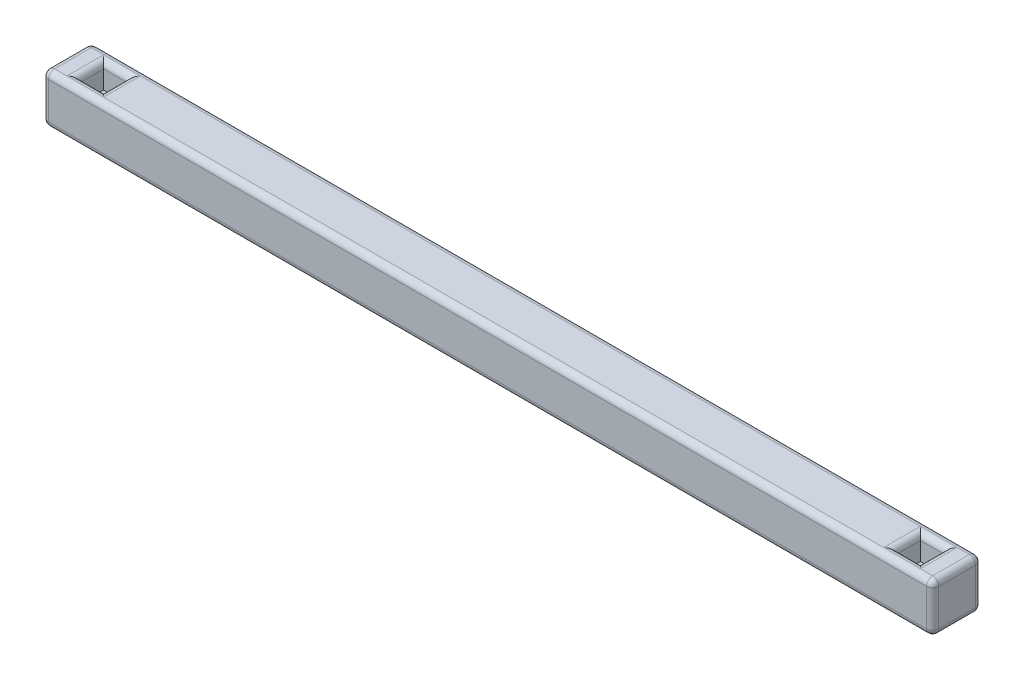
ISO-10303-21;
HEADER;
FILE_DESCRIPTION(('STEP AP214'),'2;1');
FILE_NAME('part.step','',(''),(''),'','','');
FILE_SCHEMA(('AUTOMOTIVE_DESIGN { 1 0 10303 214 1 1 1 1 }'));
ENDSEC;
DATA;
#1=APPLICATION_CONTEXT('core data for automotive mechanical design processes');
#2=APPLICATION_PROTOCOL_DEFINITION('international standard','automotive_design',2000,#1);
#3=PRODUCT_CONTEXT('',#1,'mechanical');
#4=PRODUCT('Part','Part','',(#3));
#5=PRODUCT_RELATED_PRODUCT_CATEGORY('part','',(#4));
#6=PRODUCT_DEFINITION_FORMATION('','',#4);
#7=PRODUCT_DEFINITION_CONTEXT('part definition',#1,'design');
#8=PRODUCT_DEFINITION('design','',#6,#7);
#9=PRODUCT_DEFINITION_SHAPE('','',#8);
#10=(LENGTH_UNIT() NAMED_UNIT(*) SI_UNIT(.MILLI.,.METRE.));
#11=(NAMED_UNIT(*) PLANE_ANGLE_UNIT() SI_UNIT($,.RADIAN.));
#12=(NAMED_UNIT(*) SI_UNIT($,.STERADIAN.) SOLID_ANGLE_UNIT());
#13=UNCERTAINTY_MEASURE_WITH_UNIT(LENGTH_MEASURE(1.E-05),#10,'distance_accuracy_value','');
#14=(GEOMETRIC_REPRESENTATION_CONTEXT(3) GLOBAL_UNCERTAINTY_ASSIGNED_CONTEXT((#13)) GLOBAL_UNIT_ASSIGNED_CONTEXT((#10,
#11,#12)) REPRESENTATION_CONTEXT('',''));
#15=CARTESIAN_POINT('',(0.,0.,0.));
#16=DIRECTION('',(0.,0.,1.));
#17=DIRECTION('',(1.,0.,0.));
#18=AXIS2_PLACEMENT_3D('',#15,#16,#17);
#19=CARTESIAN_POINT('',(0.,12.7,0.));
#20=DIRECTION('',(0.,-1.,0.));
#21=DIRECTION('',(0.,0.,-1.));
#22=AXIS2_PLACEMENT_3D('',#19,#20,#21);
#23=PLANE('',#22);
#24=DIRECTION('',(0.,0.,1.));
#25=VECTOR('',#24,1.);
#26=CARTESIAN_POINT('',(4.76250000000004,12.7,0.));
#27=LINE('',#26,#25);
#28=CARTESIAN_POINT('',(4.76250000000006,12.7,-1.5875));
#29=VERTEX_POINT('',#28);
#30=CARTESIAN_POINT('',(4.76250000000008,12.7,-11.1125000000005));
#31=VERTEX_POINT('',#30);
#32=EDGE_CURVE('E366',#29,#31,#27,.F.);
#33=ORIENTED_EDGE('',*,*,#32,.T.);
#34=DIRECTION('',(1.,0.,0.));
#35=VECTOR('',#34,1.);
#36=CARTESIAN_POINT('',(0.,12.7,-11.1125));
#37=LINE('',#36,#35);
#38=CARTESIAN_POINT('',(1.58750000000002,12.7,-11.1125));
#39=VERTEX_POINT('',#38);
#40=EDGE_CURVE('E372',#31,#39,#37,.F.);
#41=ORIENTED_EDGE('',*,*,#40,.T.);
#42=DIRECTION('',(0.,0.,-1.));
#43=VECTOR('',#42,1.);
#44=CARTESIAN_POINT('',(1.5875,12.7,0.));
#45=LINE('',#44,#43);
#46=CARTESIAN_POINT('',(1.5875,12.7,-1.5875));
#47=VERTEX_POINT('',#46);
#48=EDGE_CURVE('E369',#39,#47,#45,.F.);
#49=ORIENTED_EDGE('',*,*,#48,.T.);
#50=DIRECTION('',(1.,0.,0.));
#51=VECTOR('',#50,1.);
#52=CARTESIAN_POINT('',(0.,12.7,-1.5875));
#53=LINE('',#52,#51);
#54=EDGE_CURVE('E363',#47,#29,#53,.T.);
#55=ORIENTED_EDGE('',*,*,#54,.T.);
#56=EDGE_LOOP('',(#33,#41,#49,#55));
#57=FACE_BOUND('',#56,.T.);
#58=ADVANCED_FACE('F49',(#57),#23,.F.);
#59=DIRECTION('',(0.,0.,1.));
#60=VECTOR('',#59,1.);
#61=CARTESIAN_POINT('',(216.535,12.7,0.));
#62=LINE('',#61,#60);
#63=CARTESIAN_POINT('',(216.535,12.7,-1.5875));
#64=VERTEX_POINT('',#63);
#65=CARTESIAN_POINT('',(216.535,12.7,-11.1125));
#66=VERTEX_POINT('',#65);
#67=EDGE_CURVE('E353',#64,#66,#62,.F.);
#68=ORIENTED_EDGE('',*,*,#67,.T.);
#69=DIRECTION('',(1.,0.,0.));
#70=VECTOR('',#69,1.);
#71=CARTESIAN_POINT('',(0.,12.7,-11.1125));
#72=LINE('',#71,#70);
#73=CARTESIAN_POINT('',(14.2875000000001,12.7,-11.1125000000004));
#74=VERTEX_POINT('',#73);
#75=EDGE_CURVE('E359',#66,#74,#72,.F.);
#76=ORIENTED_EDGE('',*,*,#75,.T.);
#77=DIRECTION('',(0.,0.,-1.));
#78=VECTOR('',#77,1.);
#79=CARTESIAN_POINT('',(14.2875,12.7,0.));
#80=LINE('',#79,#78);
#81=CARTESIAN_POINT('',(14.2875,12.7,-1.5875));
#82=VERTEX_POINT('',#81);
#83=EDGE_CURVE('E356',#74,#82,#80,.F.);
#84=ORIENTED_EDGE('',*,*,#83,.T.);
#85=DIRECTION('',(1.,0.,0.));
#86=VECTOR('',#85,1.);
#87=CARTESIAN_POINT('',(0.,12.7,-1.5875));
#88=LINE('',#87,#86);
#89=EDGE_CURVE('E350',#82,#64,#88,.T.);
#90=ORIENTED_EDGE('',*,*,#89,.T.);
#91=EDGE_LOOP('',(#68,#76,#84,#90));
#92=FACE_BOUND('',#91,.T.);
#93=ADVANCED_FACE('F628',(#92),#23,.F.);
#94=CARTESIAN_POINT('',(0.,12.7,0.));
#95=DIRECTION('',(-1.,0.,0.));
#96=DIRECTION('',(0.,0.,1.));
#97=AXIS2_PLACEMENT_3D('',#94,#95,#96);
#98=PLANE('',#97);
#99=DIRECTION('',(0.,-1.,0.));
#100=VECTOR('',#99,1.);
#101=CARTESIAN_POINT('',(0.,12.7,-11.1125));
#102=LINE('',#101,#100);
#103=CARTESIAN_POINT('',(0.,11.1125,-11.1125));
#104=VERTEX_POINT('',#103);
#105=CARTESIAN_POINT('',(0.,1.5875,-11.1125));
#106=VERTEX_POINT('',#105);
#107=EDGE_CURVE('E317',#104,#106,#102,.T.);
#108=ORIENTED_EDGE('',*,*,#107,.T.);
#109=DIRECTION('',(0.,0.,-1.));
#110=VECTOR('',#109,1.);
#111=CARTESIAN_POINT('',(0.,1.5875,0.));
#112=LINE('',#111,#110);
#113=CARTESIAN_POINT('',(0.,1.5875,-1.5875));
#114=VERTEX_POINT('',#113);
#115=EDGE_CURVE('E320',#106,#114,#112,.F.);
#116=ORIENTED_EDGE('',*,*,#115,.T.);
#117=DIRECTION('',(0.,-1.,0.));
#118=VECTOR('',#117,1.);
#119=CARTESIAN_POINT('',(0.,12.7,-1.5875));
#120=LINE('',#119,#118);
#121=CARTESIAN_POINT('',(0.,11.1125,-1.5875));
#122=VERTEX_POINT('',#121);
#123=EDGE_CURVE('E311',#114,#122,#120,.F.);
#124=ORIENTED_EDGE('',*,*,#123,.T.);
#125=DIRECTION('',(0.,0.,-1.));
#126=VECTOR('',#125,1.);
#127=CARTESIAN_POINT('',(0.,11.1125,-12.7));
#128=LINE('',#127,#126);
#129=EDGE_CURVE('E314',#122,#104,#128,.T.);
#130=ORIENTED_EDGE('',*,*,#129,.T.);
#131=EDGE_LOOP('',(#108,#116,#124,#130));
#132=FACE_BOUND('',#131,.T.);
#133=ADVANCED_FACE('F635',(#132),#98,.T.);
#134=CARTESIAN_POINT('',(0.,12.7,0.));
#135=DIRECTION('',(0.,0.,-1.));
#136=DIRECTION('',(-1.,0.,0.));
#137=AXIS2_PLACEMENT_3D('',#134,#135,#136);
#138=PLANE('',#137);
#139=DIRECTION('',(1.,0.,0.));
#140=VECTOR('',#139,1.);
#141=CARTESIAN_POINT('',(0.,11.1125,0.));
#142=LINE('',#141,#140);
#143=CARTESIAN_POINT('',(229.235,11.1125,0.));
#144=VERTEX_POINT('',#143);
#145=CARTESIAN_POINT('',(1.5875,11.1125,0.));
#146=VERTEX_POINT('',#145);
#147=EDGE_CURVE('E59',#144,#146,#142,.F.);
#148=ORIENTED_EDGE('',*,*,#147,.T.);
#149=DIRECTION('',(0.,-1.,0.));
#150=VECTOR('',#149,1.);
#151=CARTESIAN_POINT('',(1.5875,0.,0.));
#152=LINE('',#151,#150);
#153=CARTESIAN_POINT('',(1.5875,1.5875,0.));
#154=VERTEX_POINT('',#153);
#155=EDGE_CURVE('E11',#146,#154,#152,.T.);
#156=ORIENTED_EDGE('',*,*,#155,.T.);
#157=DIRECTION('',(1.,0.,0.));
#158=VECTOR('',#157,1.);
#159=CARTESIAN_POINT('',(230.8225,1.5875,0.));
#160=LINE('',#159,#158);
#161=CARTESIAN_POINT('',(229.235,1.5875,0.));
#162=VERTEX_POINT('',#161);
#163=EDGE_CURVE('E401',#154,#162,#160,.T.);
#164=ORIENTED_EDGE('',*,*,#163,.T.);
#165=DIRECTION('',(0.,-1.,0.));
#166=VECTOR('',#165,1.);
#167=CARTESIAN_POINT('',(229.235,12.7,0.));
#168=LINE('',#167,#166);
#169=EDGE_CURVE('E70',#162,#144,#168,.F.);
#170=ORIENTED_EDGE('',*,*,#169,.T.);
#171=EDGE_LOOP('',(#148,#156,#164,#170));
#172=FACE_BOUND('',#171,.T.);
#173=ADVANCED_FACE('F557',(#172),#138,.F.);
#174=CARTESIAN_POINT('',(230.8225,12.7,0.));
#175=DIRECTION('',(-1.,0.,0.));
#176=DIRECTION('',(0.,0.,1.));
#177=AXIS2_PLACEMENT_3D('',#174,#175,#176);
#178=PLANE('',#177);
#179=DIRECTION('',(0.,-1.,0.));
#180=VECTOR('',#179,1.);
#181=CARTESIAN_POINT('',(230.8225,12.7,-1.5875));
#182=LINE('',#181,#180);
#183=CARTESIAN_POINT('',(230.8225,11.1125,-1.5875));
#184=VERTEX_POINT('',#183);
#185=CARTESIAN_POINT('',(230.8225,1.5875,-1.5875));
#186=VERTEX_POINT('',#185);
#187=EDGE_CURVE('E252',#184,#186,#182,.T.);
#188=ORIENTED_EDGE('',*,*,#187,.T.);
#189=DIRECTION('',(0.,0.,-1.));
#190=VECTOR('',#189,1.);
#191=CARTESIAN_POINT('',(230.8225,1.5875,-12.7));
#192=LINE('',#191,#190);
#193=CARTESIAN_POINT('',(230.8225,1.5875,-11.1125));
#194=VERTEX_POINT('',#193);
#195=EDGE_CURVE('E294',#186,#194,#192,.T.);
#196=ORIENTED_EDGE('',*,*,#195,.T.);
#197=DIRECTION('',(0.,-1.,0.));
#198=VECTOR('',#197,1.);
#199=CARTESIAN_POINT('',(230.8225,12.7,-11.1125));
#200=LINE('',#199,#198);
#201=CARTESIAN_POINT('',(230.8225,11.1125,-11.1125));
#202=VERTEX_POINT('',#201);
#203=EDGE_CURVE('E291',#194,#202,#200,.F.);
#204=ORIENTED_EDGE('',*,*,#203,.T.);
#205=DIRECTION('',(0.,0.,-1.));
#206=VECTOR('',#205,1.);
#207=CARTESIAN_POINT('',(230.8225,11.1125,0.));
#208=LINE('',#207,#206);
#209=EDGE_CURVE('E288',#202,#184,#208,.F.);
#210=ORIENTED_EDGE('',*,*,#209,.T.);
#211=EDGE_LOOP('',(#188,#196,#204,#210));
#212=FACE_BOUND('',#211,.T.);
#213=ADVANCED_FACE('F577',(#212),#178,.F.);
#214=CARTESIAN_POINT('',(0.,12.7,-12.7));
#215=DIRECTION('',(0.,0.,-1.));
#216=DIRECTION('',(-1.,0.,0.));
#217=AXIS2_PLACEMENT_3D('',#214,#215,#216);
#218=PLANE('',#217);
#219=DIRECTION('',(0.,-1.,0.));
#220=VECTOR('',#219,1.);
#221=CARTESIAN_POINT('',(229.235,0.,-12.7));
#222=LINE('',#221,#220);
#223=CARTESIAN_POINT('',(229.235,11.1125,-12.7));
#224=VERTEX_POINT('',#223);
#225=CARTESIAN_POINT('',(229.235,1.5875,-12.7));
#226=VERTEX_POINT('',#225);
#227=EDGE_CURVE('E330',#224,#226,#222,.T.);
#228=ORIENTED_EDGE('',*,*,#227,.T.);
#229=DIRECTION('',(1.,0.,0.));
#230=VECTOR('',#229,1.);
#231=CARTESIAN_POINT('',(0.,1.5875,-12.7));
#232=LINE('',#231,#230);
#233=CARTESIAN_POINT('',(1.58750000000002,1.5875,-12.7));
#234=VERTEX_POINT('',#233);
#235=EDGE_CURVE('E334',#226,#234,#232,.F.);
#236=ORIENTED_EDGE('',*,*,#235,.T.);
#237=DIRECTION('',(0.,-1.,0.));
#238=VECTOR('',#237,1.);
#239=CARTESIAN_POINT('',(1.58750000000002,12.7,-12.7));
#240=LINE('',#239,#238);
#241=CARTESIAN_POINT('',(1.58750000000002,11.1125,-12.7));
#242=VERTEX_POINT('',#241);
#243=EDGE_CURVE('E327',#234,#242,#240,.F.);
#244=ORIENTED_EDGE('',*,*,#243,.T.);
#245=DIRECTION('',(1.,0.,0.));
#246=VECTOR('',#245,1.);
#247=CARTESIAN_POINT('',(230.8225,11.1125,-12.7));
#248=LINE('',#247,#246);
#249=EDGE_CURVE('E324',#242,#224,#248,.T.);
#250=ORIENTED_EDGE('',*,*,#249,.T.);
#251=EDGE_LOOP('',(#228,#236,#244,#250));
#252=FACE_BOUND('',#251,.T.);
#253=ADVANCED_FACE('F641',(#252),#218,.T.);
#254=DIRECTION('',(0.,0.,-1.));
#255=VECTOR('',#254,1.);
#256=CARTESIAN_POINT('',(229.235,12.7,5.00988139862102E-13));
#257=LINE('',#256,#255);
#258=CARTESIAN_POINT('',(229.235,12.7,-1.5875));
#259=VERTEX_POINT('',#258);
#260=CARTESIAN_POINT('',(229.235,12.7,-11.1125));
#261=VERTEX_POINT('',#260);
#262=EDGE_CURVE('E343',#259,#261,#257,.T.);
#263=ORIENTED_EDGE('',*,*,#262,.T.);
#264=DIRECTION('',(1.,0.,0.));
#265=VECTOR('',#264,1.);
#266=CARTESIAN_POINT('',(0.,12.7,-11.1125));
#267=LINE('',#266,#265);
#268=CARTESIAN_POINT('',(226.06,12.7,-11.1125));
#269=VERTEX_POINT('',#268);
#270=EDGE_CURVE('E346',#261,#269,#267,.F.);
#271=ORIENTED_EDGE('',*,*,#270,.T.);
#272=DIRECTION('',(0.,0.,-1.));
#273=VECTOR('',#272,1.);
#274=CARTESIAN_POINT('',(226.06,12.7,0.));
#275=LINE('',#274,#273);
#276=CARTESIAN_POINT('',(226.06,12.7,-1.5875));
#277=VERTEX_POINT('',#276);
#278=EDGE_CURVE('E340',#269,#277,#275,.F.);
#279=ORIENTED_EDGE('',*,*,#278,.T.);
#280=DIRECTION('',(1.,0.,0.));
#281=VECTOR('',#280,1.);
#282=CARTESIAN_POINT('',(0.,12.7,-1.5875));
#283=LINE('',#282,#281);
#284=EDGE_CURVE('E337',#277,#259,#283,.T.);
#285=ORIENTED_EDGE('',*,*,#284,.T.);
#286=EDGE_LOOP('',(#263,#271,#279,#285));
#287=FACE_BOUND('',#286,.T.);
#288=ADVANCED_FACE('F630',(#287),#23,.F.);
#289=CARTESIAN_POINT('',(0.,0.,0.));
#290=DIRECTION('',(0.,-1.,0.));
#291=DIRECTION('',(0.,0.,-1.));
#292=AXIS2_PLACEMENT_3D('',#289,#290,#291);
#293=PLANE('',#292);
#294=DIRECTION('',(0.,0.,-1.));
#295=VECTOR('',#294,1.);
#296=CARTESIAN_POINT('',(1.5875,0.,0.));
#297=LINE('',#296,#295);
#298=CARTESIAN_POINT('',(1.5875,0.,-1.5875));
#299=VERTEX_POINT('',#298);
#300=CARTESIAN_POINT('',(1.58750000000002,0.,-11.1125));
#301=VERTEX_POINT('',#300);
#302=EDGE_CURVE('E301',#299,#301,#297,.T.);
#303=ORIENTED_EDGE('',*,*,#302,.T.);
#304=DIRECTION('',(1.,0.,0.));
#305=VECTOR('',#304,1.);
#306=CARTESIAN_POINT('',(0.,0.,-11.1125));
#307=LINE('',#306,#305);
#308=CARTESIAN_POINT('',(229.235,0.,-11.1125));
#309=VERTEX_POINT('',#308);
#310=EDGE_CURVE('E308',#301,#309,#307,.T.);
#311=ORIENTED_EDGE('',*,*,#310,.T.);
#312=DIRECTION('',(0.,0.,-1.));
#313=VECTOR('',#312,1.);
#314=CARTESIAN_POINT('',(229.235,0.,0.));
#315=LINE('',#314,#313);
#316=CARTESIAN_POINT('',(229.235,0.,-1.5875));
#317=VERTEX_POINT('',#316);
#318=EDGE_CURVE('E304',#309,#317,#315,.F.);
#319=ORIENTED_EDGE('',*,*,#318,.T.);
#320=DIRECTION('',(1.,0.,0.));
#321=VECTOR('',#320,1.);
#322=CARTESIAN_POINT('',(0.,0.,-1.5875));
#323=LINE('',#322,#321);
#324=EDGE_CURVE('E298',#317,#299,#323,.F.);
#325=ORIENTED_EDGE('',*,*,#324,.T.);
#326=EDGE_LOOP('',(#303,#311,#319,#325));
#327=FACE_BOUND('',#326,.T.);
#328=ADVANCED_FACE('F640',(#327),#293,.T.);
#329=CARTESIAN_POINT('',(12.7000000000001,6.35,-9.52500000000045));
#330=DIRECTION('',(1.,0.,0.));
#331=DIRECTION('',(0.,0.,-1.));
#332=AXIS2_PLACEMENT_3D('',#329,#330,#331);
#333=PLANE('',#332);
#334=DIRECTION('',(0.,1.,0.));
#335=VECTOR('',#334,1.);
#336=CARTESIAN_POINT('',(12.7,6.35,-3.17500000000045));
#337=LINE('',#336,#335);
#338=CARTESIAN_POINT('',(12.7,6.35,-3.17500000000045));
#339=VERTEX_POINT('',#338);
#340=CARTESIAN_POINT('',(12.7,11.1125,-3.17500000000045));
#341=VERTEX_POINT('',#340);
#342=EDGE_CURVE('E272',#339,#341,#337,.T.);
#343=ORIENTED_EDGE('',*,*,#342,.T.);
#344=DIRECTION('',(0.,0.,-1.));
#345=VECTOR('',#344,1.);
#346=CARTESIAN_POINT('',(12.7000000000001,11.1125,-9.52500000000045));
#347=LINE('',#346,#345);
#348=CARTESIAN_POINT('',(12.7000000000001,11.1125,-9.52500000000045));
#349=VERTEX_POINT('',#348);
#350=EDGE_CURVE('E383',#341,#349,#347,.T.);
#351=ORIENTED_EDGE('',*,*,#350,.T.);
#352=DIRECTION('',(0.,1.,0.));
#353=VECTOR('',#352,1.);
#354=CARTESIAN_POINT('',(12.7000000000001,6.35,-9.52500000000045));
#355=LINE('',#354,#353);
#356=CARTESIAN_POINT('',(12.7000000000001,6.35,-9.52500000000045));
#357=VERTEX_POINT('',#356);
#358=EDGE_CURVE('E259',#357,#349,#355,.T.);
#359=ORIENTED_EDGE('',*,*,#358,.F.);
#360=DIRECTION('',(0.,0.,-1.));
#361=VECTOR('',#360,1.);
#362=CARTESIAN_POINT('',(12.7000000000001,6.35,-9.52500000000045));
#363=LINE('',#362,#361);
#364=EDGE_CURVE('E238',#339,#357,#363,.T.);
#365=ORIENTED_EDGE('',*,*,#364,.F.);
#366=EDGE_LOOP('',(#343,#351,#359,#365));
#367=FACE_BOUND('',#366,.T.);
#368=ADVANCED_FACE('F647',(#367),#333,.F.);
#369=CARTESIAN_POINT('',(12.7,6.35,-3.17500000000045));
#370=DIRECTION('',(0.,0.,1.));
#371=DIRECTION('',(1.,0.,0.));
#372=AXIS2_PLACEMENT_3D('',#369,#370,#371);
#373=PLANE('',#372);
#374=DIRECTION('',(0.,1.,0.));
#375=VECTOR('',#374,1.);
#376=CARTESIAN_POINT('',(6.35000000000005,6.35,-3.17500000000048));
#377=LINE('',#376,#375);
#378=CARTESIAN_POINT('',(6.35000000000005,6.35,-3.17500000000048));
#379=VERTEX_POINT('',#378);
#380=CARTESIAN_POINT('',(6.35000000000005,11.1125,-3.17500000000048));
#381=VERTEX_POINT('',#380);
#382=EDGE_CURVE('E268',#379,#381,#377,.T.);
#383=ORIENTED_EDGE('',*,*,#382,.T.);
#384=DIRECTION('',(1.,0.,0.));
#385=VECTOR('',#384,1.);
#386=CARTESIAN_POINT('',(12.7,11.1125,-3.17500000000045));
#387=LINE('',#386,#385);
#388=EDGE_CURVE('E380',#381,#341,#387,.T.);
#389=ORIENTED_EDGE('',*,*,#388,.T.);
#390=ORIENTED_EDGE('',*,*,#342,.F.);
#391=DIRECTION('',(1.,0.,0.));
#392=VECTOR('',#391,1.);
#393=CARTESIAN_POINT('',(12.7,6.35,-3.17500000000045));
#394=LINE('',#393,#392);
#395=EDGE_CURVE('E263',#379,#339,#394,.T.);
#396=ORIENTED_EDGE('',*,*,#395,.F.);
#397=EDGE_LOOP('',(#383,#389,#390,#396));
#398=FACE_BOUND('',#397,.T.);
#399=ADVANCED_FACE('F712',(#398),#373,.F.);
#400=CARTESIAN_POINT('',(6.35000000000008,6.35,-9.52500000000048));
#401=DIRECTION('',(-1.,0.,0.));
#402=DIRECTION('',(0.,0.,1.));
#403=AXIS2_PLACEMENT_3D('',#400,#401,#402);
#404=PLANE('',#403);
#405=DIRECTION('',(0.,1.,0.));
#406=VECTOR('',#405,1.);
#407=CARTESIAN_POINT('',(6.35000000000008,6.35,-9.52500000000048));
#408=LINE('',#407,#406);
#409=CARTESIAN_POINT('',(6.35000000000008,6.35,-9.52500000000048));
#410=VERTEX_POINT('',#409);
#411=CARTESIAN_POINT('',(6.35000000000008,11.1125,-9.52500000000048));
#412=VERTEX_POINT('',#411);
#413=EDGE_CURVE('E264',#410,#412,#408,.T.);
#414=ORIENTED_EDGE('',*,*,#413,.T.);
#415=DIRECTION('',(0.,0.,1.));
#416=VECTOR('',#415,1.);
#417=CARTESIAN_POINT('',(6.35000000000008,11.1125,-9.52500000000048));
#418=LINE('',#417,#416);
#419=EDGE_CURVE('E376',#412,#381,#418,.T.);
#420=ORIENTED_EDGE('',*,*,#419,.T.);
#421=ORIENTED_EDGE('',*,*,#382,.F.);
#422=DIRECTION('',(0.,0.,1.));
#423=VECTOR('',#422,1.);
#424=CARTESIAN_POINT('',(6.35000000000008,6.35,-9.52500000000048));
#425=LINE('',#424,#423);
#426=EDGE_CURVE('E279',#410,#379,#425,.T.);
#427=ORIENTED_EDGE('',*,*,#426,.F.);
#428=EDGE_LOOP('',(#414,#420,#421,#427));
#429=FACE_BOUND('',#428,.T.);
#430=ADVANCED_FACE('F723',(#429),#404,.F.);
#431=CARTESIAN_POINT('',(12.7000000000001,6.35,-9.52500000000045));
#432=DIRECTION('',(0.,0.,-1.));
#433=DIRECTION('',(-1.,0.,0.));
#434=AXIS2_PLACEMENT_3D('',#431,#432,#433);
#435=PLANE('',#434);
#436=ORIENTED_EDGE('',*,*,#358,.T.);
#437=DIRECTION('',(-1.,0.,0.));
#438=VECTOR('',#437,1.);
#439=CARTESIAN_POINT('',(12.7000000000001,11.1125,-9.52500000000045));
#440=LINE('',#439,#438);
#441=EDGE_CURVE('E386',#349,#412,#440,.T.);
#442=ORIENTED_EDGE('',*,*,#441,.T.);
#443=ORIENTED_EDGE('',*,*,#413,.F.);
#444=DIRECTION('',(-1.,0.,0.));
#445=VECTOR('',#444,1.);
#446=CARTESIAN_POINT('',(12.7000000000001,6.35,-9.52500000000045));
#447=LINE('',#446,#445);
#448=EDGE_CURVE('E242',#357,#410,#447,.T.);
#449=ORIENTED_EDGE('',*,*,#448,.F.);
#450=EDGE_LOOP('',(#436,#442,#443,#449));
#451=FACE_BOUND('',#450,.T.);
#452=ADVANCED_FACE('F719',(#451),#435,.F.);
#453=CARTESIAN_POINT('',(0.,6.35,0.));
#454=DIRECTION('',(0.,-1.,0.));
#455=DIRECTION('',(0.,0.,-1.));
#456=AXIS2_PLACEMENT_3D('',#453,#454,#455);
#457=PLANE('',#456);
#458=ORIENTED_EDGE('',*,*,#364,.T.);
#459=ORIENTED_EDGE('',*,*,#448,.T.);
#460=ORIENTED_EDGE('',*,*,#426,.T.);
#461=ORIENTED_EDGE('',*,*,#395,.T.);
#462=EDGE_LOOP('',(#458,#459,#460,#461));
#463=FACE_BOUND('',#462,.T.);
#464=ADVANCED_FACE('F725',(#463),#457,.F.);
#465=CARTESIAN_POINT('',(218.1225,6.35,-9.525));
#466=DIRECTION('',(-1.,0.,0.));
#467=DIRECTION('',(0.,0.,1.));
#468=AXIS2_PLACEMENT_3D('',#465,#466,#467);
#469=PLANE('',#468);
#470=DIRECTION('',(0.,1.,0.));
#471=VECTOR('',#470,1.);
#472=CARTESIAN_POINT('',(218.1225,6.35,-9.525));
#473=LINE('',#472,#471);
#474=CARTESIAN_POINT('',(218.1225,6.35,-9.525));
#475=VERTEX_POINT('',#474);
#476=CARTESIAN_POINT('',(218.1225,11.1125,-9.525));
#477=VERTEX_POINT('',#476);
#478=EDGE_CURVE('E249',#475,#477,#473,.T.);
#479=ORIENTED_EDGE('',*,*,#478,.T.);
#480=DIRECTION('',(0.,0.,1.));
#481=VECTOR('',#480,1.);
#482=CARTESIAN_POINT('',(218.1225,11.1125,-9.525));
#483=LINE('',#482,#481);
#484=CARTESIAN_POINT('',(218.1225,11.1125,-3.175));
#485=VERTEX_POINT('',#484);
#486=EDGE_CURVE('E218',#477,#485,#483,.T.);
#487=ORIENTED_EDGE('',*,*,#486,.T.);
#488=DIRECTION('',(0.,1.,0.));
#489=VECTOR('',#488,1.);
#490=CARTESIAN_POINT('',(218.1225,6.35,-3.175));
#491=LINE('',#490,#489);
#492=CARTESIAN_POINT('',(218.1225,6.35,-3.175));
#493=VERTEX_POINT('',#492);
#494=EDGE_CURVE('E210',#493,#485,#491,.T.);
#495=ORIENTED_EDGE('',*,*,#494,.F.);
#496=DIRECTION('',(0.,0.,1.));
#497=VECTOR('',#496,1.);
#498=CARTESIAN_POINT('',(218.1225,6.35,-9.525));
#499=LINE('',#498,#497);
#500=EDGE_CURVE('E215',#475,#493,#499,.T.);
#501=ORIENTED_EDGE('',*,*,#500,.F.);
#502=EDGE_LOOP('',(#479,#487,#495,#501));
#503=FACE_BOUND('',#502,.T.);
#504=ADVANCED_FACE('F213',(#503),#469,.F.);
#505=CARTESIAN_POINT('',(218.1225,6.35,-9.525));
#506=DIRECTION('',(0.,0.,-1.));
#507=DIRECTION('',(-1.,0.,0.));
#508=AXIS2_PLACEMENT_3D('',#505,#506,#507);
#509=PLANE('',#508);
#510=DIRECTION('',(0.,1.,0.));
#511=VECTOR('',#510,1.);
#512=CARTESIAN_POINT('',(224.4725,6.35,-9.525));
#513=LINE('',#512,#511);
#514=CARTESIAN_POINT('',(224.4725,6.35,-9.525));
#515=VERTEX_POINT('',#514);
#516=CARTESIAN_POINT('',(224.4725,11.1125,-9.525));
#517=VERTEX_POINT('',#516);
#518=EDGE_CURVE('E253',#515,#517,#513,.T.);
#519=ORIENTED_EDGE('',*,*,#518,.T.);
#520=DIRECTION('',(-1.,0.,0.));
#521=VECTOR('',#520,1.);
#522=CARTESIAN_POINT('',(218.1225,11.1125,-9.525));
#523=LINE('',#522,#521);
#524=EDGE_CURVE('E393',#517,#477,#523,.T.);
#525=ORIENTED_EDGE('',*,*,#524,.T.);
#526=ORIENTED_EDGE('',*,*,#478,.F.);
#527=DIRECTION('',(-1.,0.,0.));
#528=VECTOR('',#527,1.);
#529=CARTESIAN_POINT('',(218.1225,6.35,-9.525));
#530=LINE('',#529,#528);
#531=EDGE_CURVE('E223',#515,#475,#530,.T.);
#532=ORIENTED_EDGE('',*,*,#531,.F.);
#533=EDGE_LOOP('',(#519,#525,#526,#532));
#534=FACE_BOUND('',#533,.T.);
#535=ADVANCED_FACE('F730',(#534),#509,.F.);
#536=CARTESIAN_POINT('',(224.4725,6.35,-9.525));
#537=DIRECTION('',(1.,0.,0.));
#538=DIRECTION('',(0.,0.,-1.));
#539=AXIS2_PLACEMENT_3D('',#536,#537,#538);
#540=PLANE('',#539);
#541=DIRECTION('',(0.,1.,0.));
#542=VECTOR('',#541,1.);
#543=CARTESIAN_POINT('',(224.4725,6.35,-3.175));
#544=LINE('',#543,#542);
#545=CARTESIAN_POINT('',(224.4725,6.35,-3.175));
#546=VERTEX_POINT('',#545);
#547=CARTESIAN_POINT('',(224.4725,11.1125,-3.175));
#548=VERTEX_POINT('',#547);
#549=EDGE_CURVE('E222',#546,#548,#544,.T.);
#550=ORIENTED_EDGE('',*,*,#549,.T.);
#551=DIRECTION('',(0.,0.,-1.));
#552=VECTOR('',#551,1.);
#553=CARTESIAN_POINT('',(224.4725,11.1125,-9.525));
#554=LINE('',#553,#552);
#555=EDGE_CURVE('E389',#548,#517,#554,.T.);
#556=ORIENTED_EDGE('',*,*,#555,.T.);
#557=ORIENTED_EDGE('',*,*,#518,.F.);
#558=DIRECTION('',(0.,0.,-1.));
#559=VECTOR('',#558,1.);
#560=CARTESIAN_POINT('',(224.4725,6.35,-9.525));
#561=LINE('',#560,#559);
#562=EDGE_CURVE('E233',#546,#515,#561,.T.);
#563=ORIENTED_EDGE('',*,*,#562,.F.);
#564=EDGE_LOOP('',(#550,#556,#557,#563));
#565=FACE_BOUND('',#564,.T.);
#566=ADVANCED_FACE('F743',(#565),#540,.F.);
#567=CARTESIAN_POINT('',(218.1225,6.35,-3.175));
#568=DIRECTION('',(0.,0.,1.));
#569=DIRECTION('',(1.,0.,0.));
#570=AXIS2_PLACEMENT_3D('',#567,#568,#569);
#571=PLANE('',#570);
#572=ORIENTED_EDGE('',*,*,#494,.T.);
#573=DIRECTION('',(1.,0.,0.));
#574=VECTOR('',#573,1.);
#575=CARTESIAN_POINT('',(218.1225,11.1125,-3.175));
#576=LINE('',#575,#574);
#577=EDGE_CURVE('E398',#485,#548,#576,.T.);
#578=ORIENTED_EDGE('',*,*,#577,.T.);
#579=ORIENTED_EDGE('',*,*,#549,.F.);
#580=DIRECTION('',(1.,0.,0.));
#581=VECTOR('',#580,1.);
#582=CARTESIAN_POINT('',(218.1225,6.35,-3.175));
#583=LINE('',#582,#581);
#584=EDGE_CURVE('E226',#493,#546,#583,.T.);
#585=ORIENTED_EDGE('',*,*,#584,.F.);
#586=EDGE_LOOP('',(#572,#578,#579,#585));
#587=FACE_BOUND('',#586,.T.);
#588=ADVANCED_FACE('F227',(#587),#571,.F.);
#589=CARTESIAN_POINT('',(0.,6.35,0.));
#590=DIRECTION('',(0.,1.,0.));
#591=DIRECTION('',(0.,0.,1.));
#592=AXIS2_PLACEMENT_3D('',#589,#590,#591);
#593=PLANE('',#592);
#594=ORIENTED_EDGE('',*,*,#500,.T.);
#595=ORIENTED_EDGE('',*,*,#584,.T.);
#596=ORIENTED_EDGE('',*,*,#562,.T.);
#597=ORIENTED_EDGE('',*,*,#531,.T.);
#598=EDGE_LOOP('',(#594,#595,#596,#597));
#599=FACE_BOUND('',#598,.T.);
#600=ADVANCED_FACE('F235',(#599),#593,.T.);
#601=CARTESIAN_POINT('',(226.06,11.1125,-9.525));
#602=DIRECTION('',(0.,0.,-1.));
#603=DIRECTION('',(-1.,0.,0.));
#604=AXIS2_PLACEMENT_3D('',#601,#602,#603);
#605=CYLINDRICAL_SURFACE('',#604,1.5875);
#606=CARTESIAN_POINT('',(226.06,11.1125,-11.1125));
#607=DIRECTION('',(-0.707106781186547,0.,-0.707106781186547));
#608=DIRECTION('',(0.707106781186547,0.,-0.707106781186547));
#609=AXIS2_PLACEMENT_3D('',#606,#607,#608);
#610=ELLIPSE('',#609,2.24506403026729,1.5875);
#611=EDGE_CURVE('E520',#517,#269,#610,.T.);
#612=ORIENTED_EDGE('',*,*,#611,.F.);
#613=ORIENTED_EDGE('',*,*,#555,.F.);
#614=CARTESIAN_POINT('',(226.06,11.1125,-1.5875));
#615=DIRECTION('',(0.707106781186548,0.,-0.707106781186547));
#616=DIRECTION('',(-0.707106781186547,0.,-0.707106781186547));
#617=AXIS2_PLACEMENT_3D('',#614,#615,#616);
#618=ELLIPSE('',#617,2.24506403026729,1.5875);
#619=EDGE_CURVE('E524',#277,#548,#618,.F.);
#620=ORIENTED_EDGE('',*,*,#619,.F.);
#621=ORIENTED_EDGE('',*,*,#278,.F.);
#622=EDGE_LOOP('',(#612,#613,#620,#621));
#623=FACE_BOUND('',#622,.T.);
#624=ADVANCED_FACE('F51',(#623),#605,.T.);
#625=CARTESIAN_POINT('',(216.535,11.1125,-9.525));
#626=DIRECTION('',(0.,0.,1.));
#627=DIRECTION('',(1.,0.,0.));
#628=AXIS2_PLACEMENT_3D('',#625,#626,#627);
#629=CYLINDRICAL_SURFACE('',#628,1.5875);
#630=CARTESIAN_POINT('',(216.535,11.1125,-11.1125));
#631=DIRECTION('',(-0.707106781186547,0.,0.707106781186547));
#632=DIRECTION('',(-0.707106781186547,0.,-0.707106781186547));
#633=AXIS2_PLACEMENT_3D('',#630,#631,#632);
#634=ELLIPSE('',#633,2.24506403026729,1.5875);
#635=EDGE_CURVE('E516',#66,#477,#634,.F.);
#636=ORIENTED_EDGE('',*,*,#635,.F.);
#637=ORIENTED_EDGE('',*,*,#67,.F.);
#638=CARTESIAN_POINT('',(216.535,11.1125,-1.5875));
#639=DIRECTION('',(0.707106781186547,0.,0.707106781186547));
#640=DIRECTION('',(-0.707106781186548,0.,0.707106781186547));
#641=AXIS2_PLACEMENT_3D('',#638,#639,#640);
#642=ELLIPSE('',#641,2.24506403026729,1.5875);
#643=EDGE_CURVE('E528',#485,#64,#642,.T.);
#644=ORIENTED_EDGE('',*,*,#643,.F.);
#645=ORIENTED_EDGE('',*,*,#486,.F.);
#646=EDGE_LOOP('',(#636,#637,#644,#645));
#647=FACE_BOUND('',#646,.T.);
#648=ADVANCED_FACE('F753',(#647),#629,.T.);
#649=CARTESIAN_POINT('',(14.2875000000001,11.1125,-9.52500000000044));
#650=DIRECTION('',(0.,0.,-1.));
#651=DIRECTION('',(-1.,0.,0.));
#652=AXIS2_PLACEMENT_3D('',#649,#650,#651);
#653=CYLINDRICAL_SURFACE('',#652,1.5875);
#654=CARTESIAN_POINT('',(14.2875000000001,11.1125,-11.1125000000004));
#655=DIRECTION('',(-0.707106781186544,0.,-0.707106781186551));
#656=DIRECTION('',(0.707106781186551,0.,-0.707106781186544));
#657=AXIS2_PLACEMENT_3D('',#654,#655,#656);
#658=ELLIPSE('',#657,2.24506403026729,1.5875);
#659=EDGE_CURVE('E512',#349,#74,#658,.T.);
#660=ORIENTED_EDGE('',*,*,#659,.F.);
#661=ORIENTED_EDGE('',*,*,#350,.F.);
#662=CARTESIAN_POINT('',(14.2875,11.1125,-1.58750000000044));
#663=DIRECTION('',(0.707106781186551,0.,-0.707106781186544));
#664=DIRECTION('',(0.707106781186544,0.,0.707106781186551));
#665=AXIS2_PLACEMENT_3D('',#662,#663,#664);
#666=ELLIPSE('',#665,2.24506403026729,1.5875);
#667=EDGE_CURVE('E532',#82,#341,#666,.F.);
#668=ORIENTED_EDGE('',*,*,#667,.F.);
#669=ORIENTED_EDGE('',*,*,#83,.F.);
#670=EDGE_LOOP('',(#660,#661,#668,#669));
#671=FACE_BOUND('',#670,.T.);
#672=ADVANCED_FACE('F625',(#671),#653,.T.);
#673=CARTESIAN_POINT('',(4.76250000000008,11.1125,-9.52500000000049));
#674=DIRECTION('',(0.,0.,1.));
#675=DIRECTION('',(1.,0.,0.));
#676=AXIS2_PLACEMENT_3D('',#673,#674,#675);
#677=CYLINDRICAL_SURFACE('',#676,1.5875);
#678=CARTESIAN_POINT('',(4.76250000000008,11.1125,-11.1125000000005));
#679=DIRECTION('',(-0.707106781186551,0.,0.707106781186544));
#680=DIRECTION('',(0.707106781186544,0.,0.707106781186551));
#681=AXIS2_PLACEMENT_3D('',#678,#679,#680);
#682=ELLIPSE('',#681,2.24506403026729,1.5875);
#683=EDGE_CURVE('E508',#31,#412,#682,.F.);
#684=ORIENTED_EDGE('',*,*,#683,.F.);
#685=ORIENTED_EDGE('',*,*,#32,.F.);
#686=CARTESIAN_POINT('',(4.76250000000004,11.1125,-1.58750000000048));
#687=DIRECTION('',(0.707106781186544,0.,0.707106781186551));
#688=DIRECTION('',(-0.707106781186551,0.,0.707106781186544));
#689=AXIS2_PLACEMENT_3D('',#686,#687,#688);
#690=ELLIPSE('',#689,2.24506403026729,1.5875);
#691=EDGE_CURVE('E535',#381,#29,#690,.T.);
#692=ORIENTED_EDGE('',*,*,#691,.F.);
#693=ORIENTED_EDGE('',*,*,#419,.F.);
#694=EDGE_LOOP('',(#684,#685,#692,#693));
#695=FACE_BOUND('',#694,.T.);
#696=ADVANCED_FACE('F596',(#695),#677,.T.);
#697=CARTESIAN_POINT('',(1.5875,11.1125,0.));
#698=DIRECTION('',(0.,0.,1.));
#699=DIRECTION('',(1.,0.,0.));
#700=AXIS2_PLACEMENT_3D('',#697,#698,#699);
#701=CYLINDRICAL_SURFACE('',#700,1.5875);
#702=CARTESIAN_POINT('',(1.5875,11.1125,-1.5875));
#703=DIRECTION('',(0.,0.,1.));
#704=DIRECTION('',(1.,0.,0.));
#705=AXIS2_PLACEMENT_3D('',#702,#703,#704);
#706=CIRCLE('',#705,1.5875);
#707=EDGE_CURVE('E53',#47,#122,#706,.T.);
#708=ORIENTED_EDGE('',*,*,#707,.F.);
#709=ORIENTED_EDGE('',*,*,#48,.F.);
#710=CARTESIAN_POINT('',(1.58750000000002,11.1125,-11.1125));
#711=DIRECTION('',(0.,0.,-1.));
#712=DIRECTION('',(-1.,0.,0.));
#713=AXIS2_PLACEMENT_3D('',#710,#711,#712);
#714=CIRCLE('',#713,1.5875);
#715=EDGE_CURVE('E504',#104,#39,#714,.T.);
#716=ORIENTED_EDGE('',*,*,#715,.F.);
#717=ORIENTED_EDGE('',*,*,#129,.F.);
#718=EDGE_LOOP('',(#708,#709,#716,#717));
#719=FACE_BOUND('',#718,.T.);
#720=ADVANCED_FACE('F616',(#719),#701,.T.);
#721=CARTESIAN_POINT('',(1.5875,11.1125,-1.5875));
#722=DIRECTION('',(-1.,0.,0.));
#723=DIRECTION('',(0.,0.,1.));
#724=AXIS2_PLACEMENT_3D('',#721,#722,#723);
#725=SPHERICAL_SURFACE('',#724,1.5875);
#726=CARTESIAN_POINT('',(1.5875,11.1125,-1.5875));
#727=DIRECTION('',(-1.,0.,0.));
#728=DIRECTION('',(0.,0.,1.));
#729=AXIS2_PLACEMENT_3D('',#726,#727,#728);
#730=CIRCLE('',#729,1.5875);
#731=EDGE_CURVE('E497',#47,#146,#730,.F.);
#732=ORIENTED_EDGE('',*,*,#731,.F.);
#733=ORIENTED_EDGE('',*,*,#707,.T.);
#734=CARTESIAN_POINT('',(1.5875,11.1125,-1.5875));
#735=DIRECTION('',(0.,1.,0.));
#736=DIRECTION('',(0.,0.,1.));
#737=AXIS2_PLACEMENT_3D('',#734,#735,#736);
#738=CIRCLE('',#737,1.5875);
#739=EDGE_CURVE('E500',#146,#122,#738,.F.);
#740=ORIENTED_EDGE('',*,*,#739,.F.);
#741=EDGE_LOOP('',(#732,#733,#740));
#742=FACE_BOUND('',#741,.T.);
#743=ADVANCED_FACE('F547',(#742),#725,.T.);
#744=CARTESIAN_POINT('',(12.7,11.1125,-1.58750000000045));
#745=DIRECTION('',(1.,0.,0.));
#746=DIRECTION('',(0.,0.,-1.));
#747=AXIS2_PLACEMENT_3D('',#744,#745,#746);
#748=CYLINDRICAL_SURFACE('',#747,1.5875);
#749=ORIENTED_EDGE('',*,*,#388,.F.);
#750=ORIENTED_EDGE('',*,*,#691,.T.);
#751=DIRECTION('',(1.,0.,0.));
#752=VECTOR('',#751,1.);
#753=CARTESIAN_POINT('',(0.,12.7,-1.5875000000005));
#754=LINE('',#753,#752);
#755=EDGE_CURVE('E493',#82,#29,#754,.F.);
#756=ORIENTED_EDGE('',*,*,#755,.F.);
#757=ORIENTED_EDGE('',*,*,#667,.T.);
#758=EDGE_LOOP('',(#749,#750,#756,#757));
#759=FACE_BOUND('',#758,.T.);
#760=ADVANCED_FACE('F623',(#759),#748,.T.);
#761=CARTESIAN_POINT('',(218.1225,11.1125,-1.5875));
#762=DIRECTION('',(1.,0.,0.));
#763=DIRECTION('',(0.,0.,-1.));
#764=AXIS2_PLACEMENT_3D('',#761,#762,#763);
#765=CYLINDRICAL_SURFACE('',#764,1.5875);
#766=ORIENTED_EDGE('',*,*,#577,.F.);
#767=ORIENTED_EDGE('',*,*,#643,.T.);
#768=DIRECTION('',(1.,0.,0.));
#769=VECTOR('',#768,1.);
#770=CARTESIAN_POINT('',(0.,12.7,-1.58750000000002));
#771=LINE('',#770,#769);
#772=EDGE_CURVE('E489',#277,#64,#771,.F.);
#773=ORIENTED_EDGE('',*,*,#772,.F.);
#774=ORIENTED_EDGE('',*,*,#619,.T.);
#775=EDGE_LOOP('',(#766,#767,#773,#774));
#776=FACE_BOUND('',#775,.T.);
#777=ADVANCED_FACE('F702',(#776),#765,.T.);
#778=CARTESIAN_POINT('',(218.1225,11.1125,-11.1125));
#779=DIRECTION('',(-1.,0.,0.));
#780=DIRECTION('',(0.,0.,1.));
#781=AXIS2_PLACEMENT_3D('',#778,#779,#780);
#782=CYLINDRICAL_SURFACE('',#781,1.5875);
#783=ORIENTED_EDGE('',*,*,#524,.F.);
#784=ORIENTED_EDGE('',*,*,#611,.T.);
#785=DIRECTION('',(-1.,0.,0.));
#786=VECTOR('',#785,1.);
#787=CARTESIAN_POINT('',(0.,12.7,-11.1125));
#788=LINE('',#787,#786);
#789=EDGE_CURVE('E486',#66,#269,#788,.F.);
#790=ORIENTED_EDGE('',*,*,#789,.F.);
#791=ORIENTED_EDGE('',*,*,#635,.T.);
#792=EDGE_LOOP('',(#783,#784,#790,#791));
#793=FACE_BOUND('',#792,.T.);
#794=ADVANCED_FACE('F699',(#793),#782,.T.);
#795=CARTESIAN_POINT('',(12.7000000000001,11.1125,-11.1125000000005));
#796=DIRECTION('',(-1.,0.,0.));
#797=DIRECTION('',(0.,0.,1.));
#798=AXIS2_PLACEMENT_3D('',#795,#796,#797);
#799=CYLINDRICAL_SURFACE('',#798,1.5875);
#800=ORIENTED_EDGE('',*,*,#441,.F.);
#801=ORIENTED_EDGE('',*,*,#659,.T.);
#802=DIRECTION('',(-1.,0.,0.));
#803=VECTOR('',#802,1.);
#804=CARTESIAN_POINT('',(0.,12.7,-11.1125000000005));
#805=LINE('',#804,#803);
#806=EDGE_CURVE('E483',#31,#74,#805,.F.);
#807=ORIENTED_EDGE('',*,*,#806,.F.);
#808=ORIENTED_EDGE('',*,*,#683,.T.);
#809=EDGE_LOOP('',(#800,#801,#807,#808));
#810=FACE_BOUND('',#809,.T.);
#811=ADVANCED_FACE('F602',(#810),#799,.T.);
#812=CARTESIAN_POINT('',(1.58750000000002,11.1125,-11.1125));
#813=DIRECTION('',(0.,1.,0.));
#814=DIRECTION('',(0.,0.,1.));
#815=AXIS2_PLACEMENT_3D('',#812,#813,#814);
#816=SPHERICAL_SURFACE('',#815,1.5875);
#817=CARTESIAN_POINT('',(1.58750000000002,11.1125,-11.1125));
#818=DIRECTION('',(0.,1.,0.));
#819=DIRECTION('',(0.,0.,1.));
#820=AXIS2_PLACEMENT_3D('',#817,#818,#819);
#821=CIRCLE('',#820,1.5875);
#822=EDGE_CURVE('E476',#104,#242,#821,.F.);
#823=ORIENTED_EDGE('',*,*,#822,.F.);
#824=ORIENTED_EDGE('',*,*,#715,.T.);
#825=CARTESIAN_POINT('',(1.58750000000002,11.1125,-11.1125));
#826=DIRECTION('',(-1.,0.,0.));
#827=DIRECTION('',(0.,0.,1.));
#828=AXIS2_PLACEMENT_3D('',#825,#826,#827);
#829=CIRCLE('',#828,1.5875);
#830=EDGE_CURVE('E480',#242,#39,#829,.F.);
#831=ORIENTED_EDGE('',*,*,#830,.F.);
#832=EDGE_LOOP('',(#823,#824,#831));
#833=FACE_BOUND('',#832,.T.);
#834=ADVANCED_FACE('F614',(#833),#816,.T.);
#835=CARTESIAN_POINT('',(1.5875,12.7,-1.5875));
#836=DIRECTION('',(0.,1.,0.));
#837=DIRECTION('',(0.,0.,1.));
#838=AXIS2_PLACEMENT_3D('',#835,#836,#837);
#839=CYLINDRICAL_SURFACE('',#838,1.5875);
#840=ORIENTED_EDGE('',*,*,#739,.T.);
#841=ORIENTED_EDGE('',*,*,#123,.F.);
#842=CARTESIAN_POINT('',(1.5875,1.5875,-1.5875));
#843=DIRECTION('',(0.,-1.,0.));
#844=DIRECTION('',(1.,0.,0.));
#845=AXIS2_PLACEMENT_3D('',#842,#843,#844);
#846=CIRCLE('',#845,1.5875);
#847=EDGE_CURVE('E469',#154,#114,#846,.T.);
#848=ORIENTED_EDGE('',*,*,#847,.F.);
#849=ORIENTED_EDGE('',*,*,#155,.F.);
#850=EDGE_LOOP('',(#840,#841,#848,#849));
#851=FACE_BOUND('',#850,.T.);
#852=ADVANCED_FACE('F555',(#851),#839,.T.);
#853=CARTESIAN_POINT('',(0.,11.1125,-1.5875));
#854=DIRECTION('',(1.,0.,0.));
#855=DIRECTION('',(0.,0.,-1.));
#856=AXIS2_PLACEMENT_3D('',#853,#854,#855);
#857=CYLINDRICAL_SURFACE('',#856,1.5875);
#858=ORIENTED_EDGE('',*,*,#731,.T.);
#859=ORIENTED_EDGE('',*,*,#147,.F.);
#860=CARTESIAN_POINT('',(229.235,11.1125,-1.5875));
#861=DIRECTION('',(1.,0.,0.));
#862=DIRECTION('',(0.,0.,-1.));
#863=AXIS2_PLACEMENT_3D('',#860,#861,#862);
#864=CIRCLE('',#863,1.5875);
#865=EDGE_CURVE('E465',#259,#144,#864,.T.);
#866=ORIENTED_EDGE('',*,*,#865,.F.);
#867=ORIENTED_EDGE('',*,*,#284,.F.);
#868=ORIENTED_EDGE('',*,*,#772,.T.);
#869=ORIENTED_EDGE('',*,*,#89,.F.);
#870=ORIENTED_EDGE('',*,*,#755,.T.);
#871=ORIENTED_EDGE('',*,*,#54,.F.);
#872=EDGE_LOOP('',(#858,#859,#866,#867,#868,#869,#870,#871));
#873=FACE_BOUND('',#872,.T.);
#874=ADVANCED_FACE('F590',(#873),#857,.T.);
#875=CARTESIAN_POINT('',(229.235,11.1125,5.00988139862102E-13));
#876=DIRECTION('',(0.,0.,-1.));
#877=DIRECTION('',(-1.,0.,0.));
#878=AXIS2_PLACEMENT_3D('',#875,#876,#877);
#879=CYLINDRICAL_SURFACE('',#878,1.5875);
#880=CARTESIAN_POINT('',(229.235,11.1125,-11.1125));
#881=DIRECTION('',(0.,0.,-1.));
#882=DIRECTION('',(-1.,0.,0.));
#883=AXIS2_PLACEMENT_3D('',#880,#881,#882);
#884=CIRCLE('',#883,1.5875);
#885=EDGE_CURVE('E457',#261,#202,#884,.T.);
#886=ORIENTED_EDGE('',*,*,#885,.F.);
#887=ORIENTED_EDGE('',*,*,#262,.F.);
#888=CARTESIAN_POINT('',(229.235,11.1125,-1.5875));
#889=DIRECTION('',(0.,0.,1.));
#890=DIRECTION('',(1.,0.,0.));
#891=AXIS2_PLACEMENT_3D('',#888,#889,#890);
#892=CIRCLE('',#891,1.5875);
#893=EDGE_CURVE('E461',#184,#259,#892,.T.);
#894=ORIENTED_EDGE('',*,*,#893,.F.);
#895=ORIENTED_EDGE('',*,*,#209,.F.);
#896=EDGE_LOOP('',(#886,#887,#894,#895));
#897=FACE_BOUND('',#896,.T.);
#898=ADVANCED_FACE('F584',(#897),#879,.T.);
#899=CARTESIAN_POINT('',(0.,11.1125,-11.1125));
#900=DIRECTION('',(-1.,0.,0.));
#901=DIRECTION('',(0.,0.,1.));
#902=AXIS2_PLACEMENT_3D('',#899,#900,#901);
#903=CYLINDRICAL_SURFACE('',#902,1.5875);
#904=ORIENTED_EDGE('',*,*,#789,.T.);
#905=ORIENTED_EDGE('',*,*,#270,.F.);
#906=CARTESIAN_POINT('',(229.235,11.1125,-11.1125));
#907=DIRECTION('',(1.,0.,0.));
#908=DIRECTION('',(0.,0.,-1.));
#909=AXIS2_PLACEMENT_3D('',#906,#907,#908);
#910=CIRCLE('',#909,1.5875);
#911=EDGE_CURVE('E453',#224,#261,#910,.T.);
#912=ORIENTED_EDGE('',*,*,#911,.F.);
#913=ORIENTED_EDGE('',*,*,#249,.F.);
#914=ORIENTED_EDGE('',*,*,#830,.T.);
#915=ORIENTED_EDGE('',*,*,#40,.F.);
#916=ORIENTED_EDGE('',*,*,#806,.T.);
#917=ORIENTED_EDGE('',*,*,#75,.F.);
#918=EDGE_LOOP('',(#904,#905,#912,#913,#914,#915,#916,#917));
#919=FACE_BOUND('',#918,.T.);
#920=ADVANCED_FACE('F607',(#919),#903,.T.);
#921=CARTESIAN_POINT('',(1.58750000000002,12.7,-11.1125));
#922=DIRECTION('',(0.,-1.,0.));
#923=DIRECTION('',(0.,0.,-1.));
#924=AXIS2_PLACEMENT_3D('',#921,#922,#923);
#925=CYLINDRICAL_SURFACE('',#924,1.5875);
#926=ORIENTED_EDGE('',*,*,#822,.T.);
#927=ORIENTED_EDGE('',*,*,#243,.F.);
#928=CARTESIAN_POINT('',(1.58750000000002,1.5875,-11.1125));
#929=DIRECTION('',(0.,-1.,0.));
#930=DIRECTION('',(0.,0.,-1.));
#931=AXIS2_PLACEMENT_3D('',#928,#929,#930);
#932=CIRCLE('',#931,1.5875);
#933=EDGE_CURVE('E449',#106,#234,#932,.T.);
#934=ORIENTED_EDGE('',*,*,#933,.F.);
#935=ORIENTED_EDGE('',*,*,#107,.F.);
#936=EDGE_LOOP('',(#926,#927,#934,#935));
#937=FACE_BOUND('',#936,.T.);
#938=ADVANCED_FACE('F664',(#937),#925,.T.);
#939=CARTESIAN_POINT('',(1.5875,1.5875,0.));
#940=DIRECTION('',(0.,0.,-1.));
#941=DIRECTION('',(-1.,0.,0.));
#942=AXIS2_PLACEMENT_3D('',#939,#940,#941);
#943=CYLINDRICAL_SURFACE('',#942,1.5875);
#944=CARTESIAN_POINT('',(1.5875,1.5875,-1.5875));
#945=DIRECTION('',(0.,0.,1.));
#946=DIRECTION('',(1.,0.,0.));
#947=AXIS2_PLACEMENT_3D('',#944,#945,#946);
#948=CIRCLE('',#947,1.5875);
#949=EDGE_CURVE('E472',#114,#299,#948,.T.);
#950=ORIENTED_EDGE('',*,*,#949,.F.);
#951=ORIENTED_EDGE('',*,*,#115,.F.);
#952=CARTESIAN_POINT('',(1.58750000000002,1.5875,-11.1125));
#953=DIRECTION('',(0.,0.,-1.));
#954=DIRECTION('',(-1.,0.,0.));
#955=AXIS2_PLACEMENT_3D('',#952,#953,#954);
#956=CIRCLE('',#955,1.5875);
#957=EDGE_CURVE('E445',#301,#106,#956,.T.);
#958=ORIENTED_EDGE('',*,*,#957,.F.);
#959=ORIENTED_EDGE('',*,*,#302,.F.);
#960=EDGE_LOOP('',(#950,#951,#958,#959));
#961=FACE_BOUND('',#960,.T.);
#962=ADVANCED_FACE('F670',(#961),#943,.T.);
#963=CARTESIAN_POINT('',(1.5875,1.5875,-1.5875));
#964=DIRECTION('',(-1.,0.,0.));
#965=DIRECTION('',(0.,0.,1.));
#966=AXIS2_PLACEMENT_3D('',#963,#964,#965);
#967=SPHERICAL_SURFACE('',#966,1.5875);
#968=ORIENTED_EDGE('',*,*,#847,.T.);
#969=ORIENTED_EDGE('',*,*,#949,.T.);
#970=CARTESIAN_POINT('',(1.5875,1.5875,-1.5875));
#971=DIRECTION('',(-1.,0.,0.));
#972=DIRECTION('',(0.,0.,1.));
#973=AXIS2_PLACEMENT_3D('',#970,#971,#972);
#974=CIRCLE('',#973,1.5875);
#975=EDGE_CURVE('E441',#154,#299,#974,.F.);
#976=ORIENTED_EDGE('',*,*,#975,.F.);
#977=EDGE_LOOP('',(#968,#969,#976));
#978=FACE_BOUND('',#977,.T.);
#979=ADVANCED_FACE('F674',(#978),#967,.T.);
#980=CARTESIAN_POINT('',(229.235,11.1125,-1.5875));
#981=DIRECTION('',(0.,1.,0.));
#982=DIRECTION('',(0.,0.,1.));
#983=AXIS2_PLACEMENT_3D('',#980,#981,#982);
#984=SPHERICAL_SURFACE('',#983,1.5875);
#985=ORIENTED_EDGE('',*,*,#893,.T.);
#986=ORIENTED_EDGE('',*,*,#865,.T.);
#987=CARTESIAN_POINT('',(229.235,11.1125,-1.5875));
#988=DIRECTION('',(0.,1.,0.));
#989=DIRECTION('',(0.,0.,1.));
#990=AXIS2_PLACEMENT_3D('',#987,#988,#989);
#991=CIRCLE('',#990,1.5875);
#992=EDGE_CURVE('E437',#184,#144,#991,.F.);
#993=ORIENTED_EDGE('',*,*,#992,.F.);
#994=EDGE_LOOP('',(#985,#986,#993));
#995=FACE_BOUND('',#994,.T.);
#996=ADVANCED_FACE('F587',(#995),#984,.T.);
#997=CARTESIAN_POINT('',(229.235,11.1125,-11.1125));
#998=DIRECTION('',(0.,1.,0.));
#999=DIRECTION('',(0.,0.,1.));
#1000=AXIS2_PLACEMENT_3D('',#997,#998,#999);
#1001=SPHERICAL_SURFACE('',#1000,1.5875);
#1002=ORIENTED_EDGE('',*,*,#911,.T.);
#1003=ORIENTED_EDGE('',*,*,#885,.T.);
#1004=CARTESIAN_POINT('',(229.235,11.1125,-11.1125));
#1005=DIRECTION('',(0.,1.,0.));
#1006=DIRECTION('',(0.,0.,1.));
#1007=AXIS2_PLACEMENT_3D('',#1004,#1005,#1006);
#1008=CIRCLE('',#1007,1.5875);
#1009=EDGE_CURVE('E433',#224,#202,#1008,.F.);
#1010=ORIENTED_EDGE('',*,*,#1009,.F.);
#1011=EDGE_LOOP('',(#1002,#1003,#1010));
#1012=FACE_BOUND('',#1011,.T.);
#1013=ADVANCED_FACE('F655',(#1012),#1001,.T.);
#1014=CARTESIAN_POINT('',(1.58750000000002,1.5875,-11.1125));
#1015=DIRECTION('',(-1.,0.,0.));
#1016=DIRECTION('',(0.,0.,1.));
#1017=AXIS2_PLACEMENT_3D('',#1014,#1015,#1016);
#1018=SPHERICAL_SURFACE('',#1017,1.5875);
#1019=ORIENTED_EDGE('',*,*,#957,.T.);
#1020=ORIENTED_EDGE('',*,*,#933,.T.);
#1021=CARTESIAN_POINT('',(1.58750000000002,1.5875,-11.1125));
#1022=DIRECTION('',(-1.,0.,0.));
#1023=DIRECTION('',(0.,0.,1.));
#1024=AXIS2_PLACEMENT_3D('',#1021,#1022,#1023);
#1025=CIRCLE('',#1024,1.5875);
#1026=EDGE_CURVE('E429',#301,#234,#1025,.F.);
#1027=ORIENTED_EDGE('',*,*,#1026,.F.);
#1028=EDGE_LOOP('',(#1019,#1020,#1027));
#1029=FACE_BOUND('',#1028,.T.);
#1030=ADVANCED_FACE('F872',(#1029),#1018,.T.);
#1031=CARTESIAN_POINT('',(0.,1.5875,-1.5875));
#1032=DIRECTION('',(-1.,0.,0.));
#1033=DIRECTION('',(0.,0.,1.));
#1034=AXIS2_PLACEMENT_3D('',#1031,#1032,#1033);
#1035=CYLINDRICAL_SURFACE('',#1034,1.5875);
#1036=ORIENTED_EDGE('',*,*,#975,.T.);
#1037=ORIENTED_EDGE('',*,*,#324,.F.);
#1038=CARTESIAN_POINT('',(229.235,1.5875,-1.5875));
#1039=DIRECTION('',(1.,0.,0.));
#1040=DIRECTION('',(0.,0.,-1.));
#1041=AXIS2_PLACEMENT_3D('',#1038,#1039,#1040);
#1042=CIRCLE('',#1041,1.5875);
#1043=EDGE_CURVE('E425',#162,#317,#1042,.T.);
#1044=ORIENTED_EDGE('',*,*,#1043,.F.);
#1045=ORIENTED_EDGE('',*,*,#163,.F.);
#1046=EDGE_LOOP('',(#1036,#1037,#1044,#1045));
#1047=FACE_BOUND('',#1046,.T.);
#1048=ADVANCED_FACE('F568',(#1047),#1035,.T.);
#1049=CARTESIAN_POINT('',(229.235,12.7,-1.5875));
#1050=DIRECTION('',(0.,-1.,0.));
#1051=DIRECTION('',(0.,0.,-1.));
#1052=AXIS2_PLACEMENT_3D('',#1049,#1050,#1051);
#1053=CYLINDRICAL_SURFACE('',#1052,1.5875);
#1054=ORIENTED_EDGE('',*,*,#992,.T.);
#1055=ORIENTED_EDGE('',*,*,#169,.F.);
#1056=CARTESIAN_POINT('',(229.235,1.5875,-1.5875));
#1057=DIRECTION('',(0.,-1.,0.));
#1058=DIRECTION('',(0.,0.,-1.));
#1059=AXIS2_PLACEMENT_3D('',#1056,#1057,#1058);
#1060=CIRCLE('',#1059,1.5875);
#1061=EDGE_CURVE('E421',#186,#162,#1060,.T.);
#1062=ORIENTED_EDGE('',*,*,#1061,.F.);
#1063=ORIENTED_EDGE('',*,*,#187,.F.);
#1064=EDGE_LOOP('',(#1054,#1055,#1062,#1063));
#1065=FACE_BOUND('',#1064,.T.);
#1066=ADVANCED_FACE('F563',(#1065),#1053,.T.);
#1067=CARTESIAN_POINT('',(229.235,12.7,-11.1125));
#1068=DIRECTION('',(0.,1.,0.));
#1069=DIRECTION('',(0.,0.,1.));
#1070=AXIS2_PLACEMENT_3D('',#1067,#1068,#1069);
#1071=CYLINDRICAL_SURFACE('',#1070,1.5875);
#1072=ORIENTED_EDGE('',*,*,#1009,.T.);
#1073=ORIENTED_EDGE('',*,*,#203,.F.);
#1074=CARTESIAN_POINT('',(229.235,1.5875,-11.1125));
#1075=DIRECTION('',(0.,-1.,0.));
#1076=DIRECTION('',(1.,0.,0.));
#1077=AXIS2_PLACEMENT_3D('',#1074,#1075,#1076);
#1078=CIRCLE('',#1077,1.5875);
#1079=EDGE_CURVE('E417',#226,#194,#1078,.T.);
#1080=ORIENTED_EDGE('',*,*,#1079,.F.);
#1081=ORIENTED_EDGE('',*,*,#227,.F.);
#1082=EDGE_LOOP('',(#1072,#1073,#1080,#1081));
#1083=FACE_BOUND('',#1082,.T.);
#1084=ADVANCED_FACE('F659',(#1083),#1071,.T.);
#1085=CARTESIAN_POINT('',(0.,1.5875,-11.1125));
#1086=DIRECTION('',(1.,0.,0.));
#1087=DIRECTION('',(0.,0.,-1.));
#1088=AXIS2_PLACEMENT_3D('',#1085,#1086,#1087);
#1089=CYLINDRICAL_SURFACE('',#1088,1.5875);
#1090=ORIENTED_EDGE('',*,*,#1026,.T.);
#1091=ORIENTED_EDGE('',*,*,#235,.F.);
#1092=CARTESIAN_POINT('',(229.235,1.5875,-11.1125));
#1093=DIRECTION('',(1.,0.,0.));
#1094=DIRECTION('',(0.,0.,-1.));
#1095=AXIS2_PLACEMENT_3D('',#1092,#1093,#1094);
#1096=CIRCLE('',#1095,1.5875);
#1097=EDGE_CURVE('E414',#309,#226,#1096,.T.);
#1098=ORIENTED_EDGE('',*,*,#1097,.F.);
#1099=ORIENTED_EDGE('',*,*,#310,.F.);
#1100=EDGE_LOOP('',(#1090,#1091,#1098,#1099));
#1101=FACE_BOUND('',#1100,.T.);
#1102=ADVANCED_FACE('F905',(#1101),#1089,.T.);
#1103=CARTESIAN_POINT('',(229.235,1.5875,-1.5875));
#1104=DIRECTION('',(0.,0.,1.));
#1105=DIRECTION('',(0.,-1.,0.));
#1106=AXIS2_PLACEMENT_3D('',#1103,#1104,#1105);
#1107=SPHERICAL_SURFACE('',#1106,1.5875);
#1108=ORIENTED_EDGE('',*,*,#1061,.T.);
#1109=ORIENTED_EDGE('',*,*,#1043,.T.);
#1110=CARTESIAN_POINT('',(229.235,1.5875,-1.5875));
#1111=DIRECTION('',(0.,0.,1.));
#1112=DIRECTION('',(1.,0.,0.));
#1113=AXIS2_PLACEMENT_3D('',#1110,#1111,#1112);
#1114=CIRCLE('',#1113,1.5875);
#1115=EDGE_CURVE('E411',#186,#317,#1114,.F.);
#1116=ORIENTED_EDGE('',*,*,#1115,.F.);
#1117=EDGE_LOOP('',(#1108,#1109,#1116));
#1118=FACE_BOUND('',#1117,.T.);
#1119=ADVANCED_FACE('F570',(#1118),#1107,.T.);
#1120=CARTESIAN_POINT('',(229.235,1.5875,-11.1125));
#1121=DIRECTION('',(0.,0.,-1.));
#1122=DIRECTION('',(-1.,0.,0.));
#1123=AXIS2_PLACEMENT_3D('',#1120,#1121,#1122);
#1124=SPHERICAL_SURFACE('',#1123,1.5875);
#1125=ORIENTED_EDGE('',*,*,#1097,.T.);
#1126=ORIENTED_EDGE('',*,*,#1079,.T.);
#1127=CARTESIAN_POINT('',(229.235,1.5875,-11.1125));
#1128=DIRECTION('',(0.,0.,-1.));
#1129=DIRECTION('',(-1.,0.,0.));
#1130=AXIS2_PLACEMENT_3D('',#1127,#1128,#1129);
#1131=CIRCLE('',#1130,1.5875);
#1132=EDGE_CURVE('E408',#309,#194,#1131,.F.);
#1133=ORIENTED_EDGE('',*,*,#1132,.F.);
#1134=EDGE_LOOP('',(#1125,#1126,#1133));
#1135=FACE_BOUND('',#1134,.T.);
#1136=ADVANCED_FACE('F923',(#1135),#1124,.T.);
#1137=CARTESIAN_POINT('',(229.235,1.5875,0.));
#1138=DIRECTION('',(0.,0.,1.));
#1139=DIRECTION('',(1.,0.,0.));
#1140=AXIS2_PLACEMENT_3D('',#1137,#1138,#1139);
#1141=CYLINDRICAL_SURFACE('',#1140,1.5875);
#1142=ORIENTED_EDGE('',*,*,#1115,.T.);
#1143=ORIENTED_EDGE('',*,*,#318,.F.);
#1144=ORIENTED_EDGE('',*,*,#1132,.T.);
#1145=ORIENTED_EDGE('',*,*,#195,.F.);
#1146=EDGE_LOOP('',(#1142,#1143,#1144,#1145));
#1147=FACE_BOUND('',#1146,.T.);
#1148=ADVANCED_FACE('F574',(#1147),#1141,.T.);
#1149=CLOSED_SHELL('',(#58,#93,#133,#173,#213,#253,#288,#328,#368,#399,#430,#452,#464,#504,#535,
#566,#588,#600,#624,#648,#672,#696,#720,#743,#760,#777,#794,#811,#834,#852,#874,#898,#920,#938,
#962,#979,#996,#1013,#1030,#1048,#1066,#1084,#1102,#1119,#1136,#1148));
#1150=MANIFOLD_SOLID_BREP('B2',#1149);
#1151=ADVANCED_BREP_SHAPE_REPRESENTATION('',(#18,#1150),#14);
#1152=SHAPE_DEFINITION_REPRESENTATION(#9,#1151);
ENDSEC;
END-ISO-10303-21;
